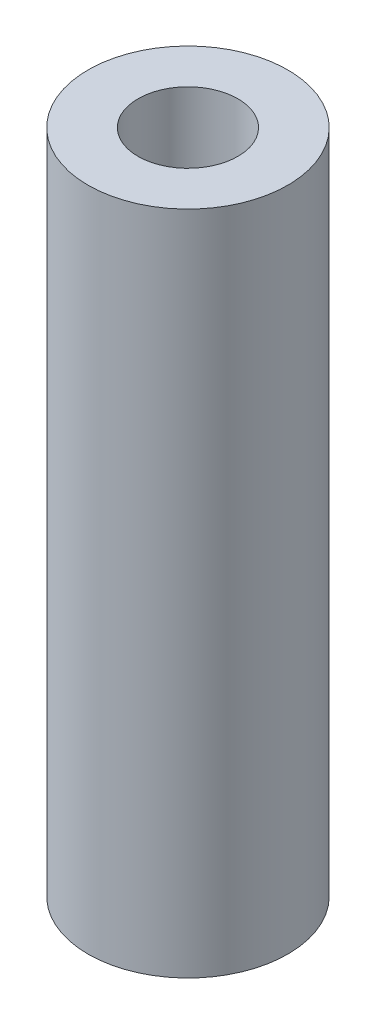
ISO-10303-21;
HEADER;
FILE_DESCRIPTION(('STEP AP214'),'2;1');
FILE_NAME('part.step','',(''),(''),'','','');
FILE_SCHEMA(('AUTOMOTIVE_DESIGN { 1 0 10303 214 1 1 1 1 }'));
ENDSEC;
DATA;
#1=APPLICATION_CONTEXT('core data for automotive mechanical design processes');
#2=APPLICATION_PROTOCOL_DEFINITION('international standard','automotive_design',2000,#1);
#3=PRODUCT_CONTEXT('',#1,'mechanical');
#4=PRODUCT('Part','Part','',(#3));
#5=PRODUCT_RELATED_PRODUCT_CATEGORY('part','',(#4));
#6=PRODUCT_DEFINITION_FORMATION('','',#4);
#7=PRODUCT_DEFINITION_CONTEXT('part definition',#1,'design');
#8=PRODUCT_DEFINITION('design','',#6,#7);
#9=PRODUCT_DEFINITION_SHAPE('','',#8);
#10=(LENGTH_UNIT() NAMED_UNIT(*) SI_UNIT(.MILLI.,.METRE.));
#11=(NAMED_UNIT(*) PLANE_ANGLE_UNIT() SI_UNIT($,.RADIAN.));
#12=(NAMED_UNIT(*) SI_UNIT($,.STERADIAN.) SOLID_ANGLE_UNIT());
#13=UNCERTAINTY_MEASURE_WITH_UNIT(LENGTH_MEASURE(1.E-05),#10,'distance_accuracy_value','');
#14=(GEOMETRIC_REPRESENTATION_CONTEXT(3) GLOBAL_UNCERTAINTY_ASSIGNED_CONTEXT((#13)) GLOBAL_UNIT_ASSIGNED_CONTEXT((#10,
#11,#12)) REPRESENTATION_CONTEXT('',''));
#15=CARTESIAN_POINT('',(0.,0.,0.));
#16=DIRECTION('',(0.,0.,1.));
#17=DIRECTION('',(1.,0.,0.));
#18=AXIS2_PLACEMENT_3D('',#15,#16,#17);
#19=CARTESIAN_POINT('',(0.,10.,0.));
#20=DIRECTION('',(0.,1.,0.));
#21=DIRECTION('',(0.,0.,1.));
#22=AXIS2_PLACEMENT_3D('',#19,#20,#21);
#23=PLANE('',#22);
#24=CARTESIAN_POINT('',(0.,10.,0.));
#25=DIRECTION('',(0.,1.,0.));
#26=DIRECTION('',(0.,0.,1.));
#27=AXIS2_PLACEMENT_3D('',#24,#25,#26);
#28=CIRCLE('',#27,3.);
#29=CARTESIAN_POINT('',(0.,10.,3.));
#30=VERTEX_POINT('',#29);
#31=EDGE_CURVE('E10',#30,#30,#28,.T.);
#32=ORIENTED_EDGE('',*,*,#31,.T.);
#33=EDGE_LOOP('',(#32));
#34=FACE_BOUND('',#33,.T.);
#35=CARTESIAN_POINT('',(0.,10.,0.));
#36=DIRECTION('',(0.,1.,0.));
#37=DIRECTION('',(0.,0.,1.));
#38=AXIS2_PLACEMENT_3D('',#35,#36,#37);
#39=CIRCLE('',#38,1.5);
#40=CARTESIAN_POINT('',(0.,10.,1.5));
#41=VERTEX_POINT('',#40);
#42=EDGE_CURVE('E50',#41,#41,#39,.T.);
#43=ORIENTED_EDGE('',*,*,#42,.F.);
#44=EDGE_LOOP('',(#43));
#45=FACE_BOUND('',#44,.T.);
#46=ADVANCED_FACE('F37',(#34,#45),#23,.T.);
#47=CARTESIAN_POINT('',(0.,-10.,0.));
#48=DIRECTION('',(0.,1.,0.));
#49=DIRECTION('',(0.,0.,1.));
#50=AXIS2_PLACEMENT_3D('',#47,#48,#49);
#51=PLANE('',#50);
#52=CARTESIAN_POINT('',(0.,-10.,0.));
#53=DIRECTION('',(0.,1.,0.));
#54=DIRECTION('',(0.,0.,1.));
#55=AXIS2_PLACEMENT_3D('',#52,#53,#54);
#56=CIRCLE('',#55,3.);
#57=CARTESIAN_POINT('',(0.,-10.,3.));
#58=VERTEX_POINT('',#57);
#59=EDGE_CURVE('E41',#58,#58,#56,.T.);
#60=ORIENTED_EDGE('',*,*,#59,.F.);
#61=EDGE_LOOP('',(#60));
#62=FACE_BOUND('',#61,.T.);
#63=CARTESIAN_POINT('',(0.,-10.,0.));
#64=DIRECTION('',(0.,1.,0.));
#65=DIRECTION('',(0.,0.,1.));
#66=AXIS2_PLACEMENT_3D('',#63,#64,#65);
#67=CIRCLE('',#66,1.5);
#68=CARTESIAN_POINT('',(0.,-10.,1.5));
#69=VERTEX_POINT('',#68);
#70=EDGE_CURVE('E52',#69,#69,#67,.T.);
#71=ORIENTED_EDGE('',*,*,#70,.T.);
#72=EDGE_LOOP('',(#71));
#73=FACE_BOUND('',#72,.T.);
#74=ADVANCED_FACE('F64',(#62,#73),#51,.F.);
#75=CARTESIAN_POINT('',(0.,10.,0.));
#76=DIRECTION('',(0.,-1.,0.));
#77=DIRECTION('',(0.,0.,-1.));
#78=AXIS2_PLACEMENT_3D('',#75,#76,#77);
#79=CYLINDRICAL_SURFACE('',#78,3.);
#80=ORIENTED_EDGE('',*,*,#31,.F.);
#81=EDGE_LOOP('',(#80));
#82=FACE_BOUND('',#81,.T.);
#83=ORIENTED_EDGE('',*,*,#59,.T.);
#84=EDGE_LOOP('',(#83));
#85=FACE_BOUND('',#84,.T.);
#86=ADVANCED_FACE('F39',(#82,#85),#79,.T.);
#87=CARTESIAN_POINT('',(0.,10.,0.));
#88=DIRECTION('',(0.,-1.,0.));
#89=DIRECTION('',(0.,0.,-1.));
#90=AXIS2_PLACEMENT_3D('',#87,#88,#89);
#91=CYLINDRICAL_SURFACE('',#90,1.5);
#92=ORIENTED_EDGE('',*,*,#42,.T.);
#93=EDGE_LOOP('',(#92));
#94=FACE_BOUND('',#93,.T.);
#95=ORIENTED_EDGE('',*,*,#70,.F.);
#96=EDGE_LOOP('',(#95));
#97=FACE_BOUND('',#96,.T.);
#98=ADVANCED_FACE('F60',(#94,#97),#91,.F.);
#99=CLOSED_SHELL('',(#46,#74,#86,#98));
#100=MANIFOLD_SOLID_BREP('B2',#99);
#101=ADVANCED_BREP_SHAPE_REPRESENTATION('',(#18,#100),#14);
#102=SHAPE_DEFINITION_REPRESENTATION(#9,#101);
ENDSEC;
END-ISO-10303-21;
